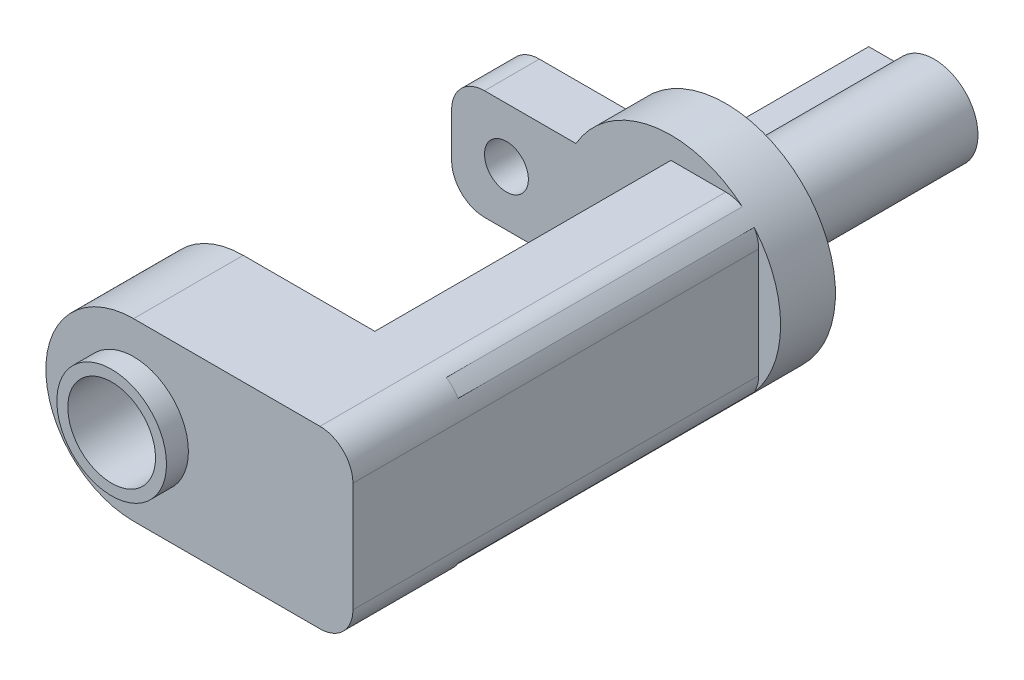
ISO-10303-21;
HEADER;
FILE_DESCRIPTION(('STEP AP214'),'2;1');
FILE_NAME('part.step','',(''),(''),'','','');
FILE_SCHEMA(('AUTOMOTIVE_DESIGN { 1 0 10303 214 1 1 1 1 }'));
ENDSEC;
DATA;
#1=APPLICATION_CONTEXT('core data for automotive mechanical design processes');
#2=APPLICATION_PROTOCOL_DEFINITION('international standard','automotive_design',2000,#1);
#3=PRODUCT_CONTEXT('',#1,'mechanical');
#4=PRODUCT('Part','Part','',(#3));
#5=PRODUCT_RELATED_PRODUCT_CATEGORY('part','',(#4));
#6=PRODUCT_DEFINITION_FORMATION('','',#4);
#7=PRODUCT_DEFINITION_CONTEXT('part definition',#1,'design');
#8=PRODUCT_DEFINITION('design','',#6,#7);
#9=PRODUCT_DEFINITION_SHAPE('','',#8);
#10=(LENGTH_UNIT() NAMED_UNIT(*) SI_UNIT(.MILLI.,.METRE.));
#11=(NAMED_UNIT(*) PLANE_ANGLE_UNIT() SI_UNIT($,.RADIAN.));
#12=(NAMED_UNIT(*) SI_UNIT($,.STERADIAN.) SOLID_ANGLE_UNIT());
#13=UNCERTAINTY_MEASURE_WITH_UNIT(LENGTH_MEASURE(1.E-05),#10,'distance_accuracy_value','');
#14=(GEOMETRIC_REPRESENTATION_CONTEXT(3) GLOBAL_UNCERTAINTY_ASSIGNED_CONTEXT((#13)) GLOBAL_UNIT_ASSIGNED_CONTEXT((#10,
#11,#12)) REPRESENTATION_CONTEXT('',''));
#15=CARTESIAN_POINT('',(0.,0.,0.));
#16=DIRECTION('',(0.,0.,1.));
#17=DIRECTION('',(1.,0.,0.));
#18=AXIS2_PLACEMENT_3D('',#15,#16,#17);
#19=CARTESIAN_POINT('',(0.,0.,61.));
#20=DIRECTION('',(0.,0.,1.));
#21=DIRECTION('',(1.,0.,0.));
#22=AXIS2_PLACEMENT_3D('',#19,#20,#21);
#23=PLANE('',#22);
#24=CARTESIAN_POINT('',(-12.,0.,61.));
#25=DIRECTION('',(0.,0.,1.));
#26=DIRECTION('',(1.,0.,0.));
#27=AXIS2_PLACEMENT_3D('',#24,#25,#26);
#28=CIRCLE('',#27,7.99999999999999);
#29=CARTESIAN_POINT('',(-12.,-7.99999999999999,61.));
#30=VERTEX_POINT('',#29);
#31=CARTESIAN_POINT('',(-12.,7.99999999999999,61.));
#32=VERTEX_POINT('',#31);
#33=EDGE_CURVE('E339',#30,#32,#28,.F.);
#34=ORIENTED_EDGE('',*,*,#33,.F.);
#35=DIRECTION('',(1.,0.,0.));
#36=VECTOR('',#35,1.);
#37=CARTESIAN_POINT('',(0.,-8.,61.));
#38=LINE('',#37,#36);
#39=CARTESIAN_POINT('',(4.99999999999998,-7.99999999999999,61.));
#40=VERTEX_POINT('',#39);
#41=EDGE_CURVE('E342',#30,#40,#38,.T.);
#42=ORIENTED_EDGE('',*,*,#41,.T.);
#43=CARTESIAN_POINT('',(5.,-5.,61.));
#44=DIRECTION('',(0.,0.,1.));
#45=DIRECTION('',(1.,0.,0.));
#46=AXIS2_PLACEMENT_3D('',#43,#44,#45);
#47=CIRCLE('',#46,3.);
#48=CARTESIAN_POINT('',(8.,-4.99999999999998,61.));
#49=VERTEX_POINT('',#48);
#50=EDGE_CURVE('E345',#49,#40,#47,.F.);
#51=ORIENTED_EDGE('',*,*,#50,.F.);
#52=DIRECTION('',(0.,1.,0.));
#53=VECTOR('',#52,1.);
#54=CARTESIAN_POINT('',(8.,0.,61.));
#55=LINE('',#54,#53);
#56=CARTESIAN_POINT('',(8.,4.99999999999998,61.));
#57=VERTEX_POINT('',#56);
#58=EDGE_CURVE('E348',#49,#57,#55,.T.);
#59=ORIENTED_EDGE('',*,*,#58,.T.);
#60=CARTESIAN_POINT('',(5.,5.,61.));
#61=DIRECTION('',(0.,0.,1.));
#62=DIRECTION('',(1.,0.,0.));
#63=AXIS2_PLACEMENT_3D('',#60,#61,#62);
#64=CIRCLE('',#63,3.);
#65=CARTESIAN_POINT('',(4.99999999999998,7.99999999999999,61.));
#66=VERTEX_POINT('',#65);
#67=EDGE_CURVE('E350',#57,#66,#64,.T.);
#68=ORIENTED_EDGE('',*,*,#67,.T.);
#69=DIRECTION('',(1.,0.,0.));
#70=VECTOR('',#69,1.);
#71=CARTESIAN_POINT('',(0.,8.00000000000003,61.));
#72=LINE('',#71,#70);
#73=EDGE_CURVE('E352',#32,#66,#72,.T.);
#74=ORIENTED_EDGE('',*,*,#73,.F.);
#75=EDGE_LOOP('',(#34,#42,#51,#59,#68,#74));
#76=FACE_BOUND('',#75,.T.);
#77=CARTESIAN_POINT('',(-12.,0.,61.));
#78=DIRECTION('',(0.,0.,1.));
#79=DIRECTION('',(1.,0.,0.));
#80=AXIS2_PLACEMENT_3D('',#77,#78,#79);
#81=CIRCLE('',#80,5.);
#82=CARTESIAN_POINT('',(-7.00000000000001,0.,61.));
#83=VERTEX_POINT('',#82);
#84=EDGE_CURVE('E588',#83,#83,#81,.T.);
#85=ORIENTED_EDGE('',*,*,#84,.F.);
#86=EDGE_LOOP('',(#85));
#87=FACE_BOUND('',#86,.T.);
#88=ADVANCED_FACE('F49',(#76,#87),#23,.T.);
#89=CARTESIAN_POINT('',(0.,0.,51.));
#90=DIRECTION('',(0.,0.,1.));
#91=DIRECTION('',(1.,0.,0.));
#92=AXIS2_PLACEMENT_3D('',#89,#90,#91);
#93=PLANE('',#92);
#94=CARTESIAN_POINT('',(-12.,0.,51.));
#95=DIRECTION('',(0.,0.,1.));
#96=DIRECTION('',(1.,0.,0.));
#97=AXIS2_PLACEMENT_3D('',#94,#95,#96);
#98=CIRCLE('',#97,4.);
#99=CARTESIAN_POINT('',(-8.00000000000001,0.,51.));
#100=VERTEX_POINT('',#99);
#101=EDGE_CURVE('E343',#100,#100,#98,.F.);
#102=ORIENTED_EDGE('',*,*,#101,.F.);
#103=EDGE_LOOP('',(#102));
#104=FACE_BOUND('',#103,.T.);
#105=CARTESIAN_POINT('',(0.,0.,51.));
#106=DIRECTION('',(0.,0.,1.));
#107=DIRECTION('',(1.,0.,0.));
#108=AXIS2_PLACEMENT_3D('',#105,#106,#107);
#109=CIRCLE('',#108,4.00000000000001);
#110=CARTESIAN_POINT('',(-2.79941684889507,2.85714285714286,51.));
#111=VERTEX_POINT('',#110);
#112=CARTESIAN_POINT('',(-2.79941684889506,-2.85714285714286,51.));
#113=VERTEX_POINT('',#112);
#114=EDGE_CURVE('E397',#111,#113,#109,.T.);
#115=ORIENTED_EDGE('',*,*,#114,.T.);
#116=CARTESIAN_POINT('',(-9.79795897113271,-10.,51.));
#117=DIRECTION('',(0.,0.,1.));
#118=DIRECTION('',(1.,0.,0.));
#119=AXIS2_PLACEMENT_3D('',#116,#117,#118);
#120=CIRCLE('',#119,10.);
#121=CARTESIAN_POINT('',(0.,-7.99999999999999,51.));
#122=VERTEX_POINT('',#121);
#123=EDGE_CURVE('E11',#113,#122,#120,.F.);
#124=ORIENTED_EDGE('',*,*,#123,.T.);
#125=DIRECTION('',(1.,0.,0.));
#126=VECTOR('',#125,1.);
#127=CARTESIAN_POINT('',(0.,-8.,51.));
#128=LINE('',#127,#126);
#129=CARTESIAN_POINT('',(-12.,-7.99999999999999,51.));
#130=VERTEX_POINT('',#129);
#131=EDGE_CURVE('E358',#130,#122,#128,.T.);
#132=ORIENTED_EDGE('',*,*,#131,.F.);
#133=CARTESIAN_POINT('',(-12.,0.,51.));
#134=DIRECTION('',(0.,0.,1.));
#135=DIRECTION('',(1.,0.,0.));
#136=AXIS2_PLACEMENT_3D('',#133,#134,#135);
#137=CIRCLE('',#136,7.99999999999999);
#138=CARTESIAN_POINT('',(-12.,7.99999999999999,51.));
#139=VERTEX_POINT('',#138);
#140=EDGE_CURVE('E325',#130,#139,#137,.F.);
#141=ORIENTED_EDGE('',*,*,#140,.T.);
#142=DIRECTION('',(1.,0.,0.));
#143=VECTOR('',#142,1.);
#144=CARTESIAN_POINT('',(0.,8.00000000000003,51.));
#145=LINE('',#144,#143);
#146=CARTESIAN_POINT('',(0.,7.99999999999999,51.));
#147=VERTEX_POINT('',#146);
#148=EDGE_CURVE('E367',#139,#147,#145,.T.);
#149=ORIENTED_EDGE('',*,*,#148,.T.);
#150=CARTESIAN_POINT('',(-9.79795897113272,10.,51.));
#151=DIRECTION('',(0.,0.,1.));
#152=DIRECTION('',(1.,0.,0.));
#153=AXIS2_PLACEMENT_3D('',#150,#151,#152);
#154=CIRCLE('',#153,10.);
#155=EDGE_CURVE('E57',#147,#111,#154,.F.);
#156=ORIENTED_EDGE('',*,*,#155,.T.);
#157=EDGE_LOOP('',(#115,#124,#132,#141,#149,#156));
#158=FACE_BOUND('',#157,.T.);
#159=ADVANCED_FACE('F453',(#104,#158),#93,.F.);
#160=CARTESIAN_POINT('',(5.,5.,51.));
#161=DIRECTION('',(0.,0.,1.));
#162=DIRECTION('',(1.,0.,0.));
#163=AXIS2_PLACEMENT_3D('',#160,#161,#162);
#164=CIRCLE('',#163,3.);
#165=CARTESIAN_POINT('',(7.59543560573178,6.50456439426822,51.));
#166=VERTEX_POINT('',#165);
#167=CARTESIAN_POINT('',(6.50456439426823,7.59543560573177,51.));
#168=VERTEX_POINT('',#167);
#169=EDGE_CURVE('E364',#166,#168,#164,.T.);
#170=ORIENTED_EDGE('',*,*,#169,.F.);
#171=CARTESIAN_POINT('',(0.,0.,51.));
#172=DIRECTION('',(0.,0.,1.));
#173=DIRECTION('',(1.,0.,0.));
#174=AXIS2_PLACEMENT_3D('',#171,#172,#173);
#175=CIRCLE('',#174,10.);
#176=EDGE_CURVE('E300',#166,#168,#175,.T.);
#177=ORIENTED_EDGE('',*,*,#176,.T.);
#178=EDGE_LOOP('',(#170,#177));
#179=FACE_BOUND('',#178,.T.);
#180=ADVANCED_FACE('F478',(#179),#93,.F.);
#181=CARTESIAN_POINT('',(-12.,0.,61.));
#182=DIRECTION('',(0.,0.,-1.));
#183=DIRECTION('',(-1.,0.,0.));
#184=AXIS2_PLACEMENT_3D('',#181,#182,#183);
#185=CYLINDRICAL_SURFACE('',#184,7.99999999999999);
#186=ORIENTED_EDGE('',*,*,#140,.F.);
#187=DIRECTION('',(0.,0.,-1.));
#188=VECTOR('',#187,1.);
#189=CARTESIAN_POINT('',(-12.,-7.99999999999999,61.));
#190=LINE('',#189,#188);
#191=EDGE_CURVE('E384',#30,#130,#190,.T.);
#192=ORIENTED_EDGE('',*,*,#191,.F.);
#193=ORIENTED_EDGE('',*,*,#33,.T.);
#194=DIRECTION('',(0.,0.,-1.));
#195=VECTOR('',#194,1.);
#196=CARTESIAN_POINT('',(-12.,7.99999999999999,61.));
#197=LINE('',#196,#195);
#198=EDGE_CURVE('E355',#32,#139,#197,.T.);
#199=ORIENTED_EDGE('',*,*,#198,.T.);
#200=EDGE_LOOP('',(#186,#192,#193,#199));
#201=FACE_BOUND('',#200,.T.);
#202=ADVANCED_FACE('F457',(#201),#185,.T.);
#203=CARTESIAN_POINT('',(0.,-8.,61.));
#204=DIRECTION('',(0.,1.,0.));
#205=DIRECTION('',(0.,0.,1.));
#206=AXIS2_PLACEMENT_3D('',#203,#204,#205);
#207=PLANE('',#206);
#208=ORIENTED_EDGE('',*,*,#131,.T.);
#209=DIRECTION('',(0.,0.,-1.));
#210=VECTOR('',#209,1.);
#211=CARTESIAN_POINT('',(0.,-7.99999999999999,68.8885438199983));
#212=LINE('',#211,#210);
#213=CARTESIAN_POINT('',(0.,-7.99999999999999,24.));
#214=VERTEX_POINT('',#213);
#215=EDGE_CURVE('E315',#122,#214,#212,.T.);
#216=ORIENTED_EDGE('',*,*,#215,.T.);
#217=DIRECTION('',(1.,0.,0.));
#218=VECTOR('',#217,1.);
#219=CARTESIAN_POINT('',(0.,-7.99999999999999,24.));
#220=LINE('',#219,#218);
#221=CARTESIAN_POINT('',(4.99999999999998,-8.,24.));
#222=VERTEX_POINT('',#221);
#223=EDGE_CURVE('E312',#214,#222,#220,.T.);
#224=ORIENTED_EDGE('',*,*,#223,.T.);
#225=DIRECTION('',(0.,0.,-1.));
#226=VECTOR('',#225,1.);
#227=CARTESIAN_POINT('',(4.99999999999998,-7.99999999999999,61.));
#228=LINE('',#227,#226);
#229=EDGE_CURVE('E381',#40,#222,#228,.T.);
#230=ORIENTED_EDGE('',*,*,#229,.F.);
#231=ORIENTED_EDGE('',*,*,#41,.F.);
#232=ORIENTED_EDGE('',*,*,#191,.T.);
#233=EDGE_LOOP('',(#208,#216,#224,#230,#231,#232));
#234=FACE_BOUND('',#233,.T.);
#235=ADVANCED_FACE('F447',(#234),#207,.F.);
#236=CARTESIAN_POINT('',(5.,-5.,61.));
#237=DIRECTION('',(0.,0.,-1.));
#238=DIRECTION('',(-1.,0.,0.));
#239=AXIS2_PLACEMENT_3D('',#236,#237,#238);
#240=CYLINDRICAL_SURFACE('',#239,3.);
#241=CARTESIAN_POINT('',(5.,-5.,51.));
#242=DIRECTION('',(0.,0.,1.));
#243=DIRECTION('',(1.,0.,0.));
#244=AXIS2_PLACEMENT_3D('',#241,#242,#243);
#245=CIRCLE('',#244,3.);
#246=CARTESIAN_POINT('',(7.59543560573178,-6.50456439426822,51.));
#247=VERTEX_POINT('',#246);
#248=CARTESIAN_POINT('',(6.50456439426823,-7.59543560573177,51.));
#249=VERTEX_POINT('',#248);
#250=EDGE_CURVE('E361',#247,#249,#245,.F.);
#251=ORIENTED_EDGE('',*,*,#250,.F.);
#252=DIRECTION('',(0.,0.,-1.));
#253=VECTOR('',#252,1.);
#254=CARTESIAN_POINT('',(7.59543560573178,-6.50456439426822,68.8885438199983));
#255=LINE('',#254,#253);
#256=CARTESIAN_POINT('',(7.59543560573178,-6.50456439426822,24.));
#257=VERTEX_POINT('',#256);
#258=EDGE_CURVE('E307',#247,#257,#255,.T.);
#259=ORIENTED_EDGE('',*,*,#258,.T.);
#260=CARTESIAN_POINT('',(5.,-5.,24.));
#261=DIRECTION('',(0.,0.,1.));
#262=DIRECTION('',(1.,0.,0.));
#263=AXIS2_PLACEMENT_3D('',#260,#261,#262);
#264=CIRCLE('',#263,3.);
#265=CARTESIAN_POINT('',(8.,-4.99999999999998,24.));
#266=VERTEX_POINT('',#265);
#267=EDGE_CURVE('E304',#257,#266,#264,.T.);
#268=ORIENTED_EDGE('',*,*,#267,.T.);
#269=DIRECTION('',(0.,0.,-1.));
#270=VECTOR('',#269,1.);
#271=CARTESIAN_POINT('',(8.,-4.99999999999998,61.));
#272=LINE('',#271,#270);
#273=EDGE_CURVE('E378',#49,#266,#272,.T.);
#274=ORIENTED_EDGE('',*,*,#273,.F.);
#275=ORIENTED_EDGE('',*,*,#50,.T.);
#276=ORIENTED_EDGE('',*,*,#229,.T.);
#277=CARTESIAN_POINT('',(5.,-5.,24.));
#278=DIRECTION('',(0.,0.,1.));
#279=DIRECTION('',(1.,0.,0.));
#280=AXIS2_PLACEMENT_3D('',#277,#278,#279);
#281=CIRCLE('',#280,3.);
#282=CARTESIAN_POINT('',(6.50456439426823,-7.59543560573177,24.));
#283=VERTEX_POINT('',#282);
#284=EDGE_CURVE('E308',#222,#283,#281,.T.);
#285=ORIENTED_EDGE('',*,*,#284,.T.);
#286=DIRECTION('',(0.,0.,-1.));
#287=VECTOR('',#286,1.);
#288=CARTESIAN_POINT('',(6.50456439426823,-7.59543560573177,68.8885438199983));
#289=LINE('',#288,#287);
#290=EDGE_CURVE('E311',#249,#283,#289,.T.);
#291=ORIENTED_EDGE('',*,*,#290,.F.);
#292=EDGE_LOOP('',(#251,#259,#268,#274,#275,#276,#285,#291));
#293=FACE_BOUND('',#292,.T.);
#294=ADVANCED_FACE('F442',(#293),#240,.T.);
#295=CARTESIAN_POINT('',(8.,0.,61.));
#296=DIRECTION('',(-1.,0.,0.));
#297=DIRECTION('',(0.,0.,1.));
#298=AXIS2_PLACEMENT_3D('',#295,#296,#297);
#299=PLANE('',#298);
#300=ORIENTED_EDGE('',*,*,#273,.T.);
#301=DIRECTION('',(0.,1.,0.));
#302=VECTOR('',#301,1.);
#303=CARTESIAN_POINT('',(8.,0.,24.));
#304=LINE('',#303,#302);
#305=CARTESIAN_POINT('',(8.,5.,24.));
#306=VERTEX_POINT('',#305);
#307=EDGE_CURVE('E301',#266,#306,#304,.T.);
#308=ORIENTED_EDGE('',*,*,#307,.T.);
#309=DIRECTION('',(0.,0.,-1.));
#310=VECTOR('',#309,1.);
#311=CARTESIAN_POINT('',(8.,4.99999999999998,61.));
#312=LINE('',#311,#310);
#313=EDGE_CURVE('E375',#57,#306,#312,.T.);
#314=ORIENTED_EDGE('',*,*,#313,.F.);
#315=ORIENTED_EDGE('',*,*,#58,.F.);
#316=EDGE_LOOP('',(#300,#308,#314,#315));
#317=FACE_BOUND('',#316,.T.);
#318=ADVANCED_FACE('F496',(#317),#299,.F.);
#319=CARTESIAN_POINT('',(5.,5.,61.));
#320=DIRECTION('',(0.,0.,-1.));
#321=DIRECTION('',(-1.,0.,0.));
#322=AXIS2_PLACEMENT_3D('',#319,#320,#321);
#323=CYLINDRICAL_SURFACE('',#322,3.);
#324=ORIENTED_EDGE('',*,*,#313,.T.);
#325=CARTESIAN_POINT('',(5.,5.,24.));
#326=DIRECTION('',(0.,0.,1.));
#327=DIRECTION('',(1.,0.,0.));
#328=AXIS2_PLACEMENT_3D('',#325,#326,#327);
#329=CIRCLE('',#328,3.);
#330=CARTESIAN_POINT('',(7.59543560573178,6.50456439426822,24.));
#331=VERTEX_POINT('',#330);
#332=EDGE_CURVE('E297',#306,#331,#329,.T.);
#333=ORIENTED_EDGE('',*,*,#332,.T.);
#334=DIRECTION('',(0.,0.,-1.));
#335=VECTOR('',#334,1.);
#336=CARTESIAN_POINT('',(7.59543560573178,6.50456439426822,68.8885438199983));
#337=LINE('',#336,#335);
#338=EDGE_CURVE('E296',#166,#331,#337,.T.);
#339=ORIENTED_EDGE('',*,*,#338,.F.);
#340=ORIENTED_EDGE('',*,*,#169,.T.);
#341=DIRECTION('',(0.,0.,-1.));
#342=VECTOR('',#341,1.);
#343=CARTESIAN_POINT('',(6.50456439426823,7.59543560573177,68.8885438199983));
#344=LINE('',#343,#342);
#345=CARTESIAN_POINT('',(6.50456439426823,7.59543560573177,24.));
#346=VERTEX_POINT('',#345);
#347=EDGE_CURVE('E321',#168,#346,#344,.T.);
#348=ORIENTED_EDGE('',*,*,#347,.T.);
#349=CARTESIAN_POINT('',(5.,5.,24.));
#350=DIRECTION('',(0.,0.,1.));
#351=DIRECTION('',(1.,0.,0.));
#352=AXIS2_PLACEMENT_3D('',#349,#350,#351);
#353=CIRCLE('',#352,3.);
#354=CARTESIAN_POINT('',(4.99999999999998,7.99999999999999,24.));
#355=VERTEX_POINT('',#354);
#356=EDGE_CURVE('E217',#346,#355,#353,.T.);
#357=ORIENTED_EDGE('',*,*,#356,.T.);
#358=DIRECTION('',(0.,0.,-1.));
#359=VECTOR('',#358,1.);
#360=CARTESIAN_POINT('',(4.99999999999998,7.99999999999999,61.));
#361=LINE('',#360,#359);
#362=EDGE_CURVE('E372',#66,#355,#361,.T.);
#363=ORIENTED_EDGE('',*,*,#362,.F.);
#364=ORIENTED_EDGE('',*,*,#67,.F.);
#365=EDGE_LOOP('',(#324,#333,#339,#340,#348,#357,#363,#364));
#366=FACE_BOUND('',#365,.T.);
#367=ADVANCED_FACE('F493',(#366),#323,.T.);
#368=CARTESIAN_POINT('',(0.,8.00000000000003,61.));
#369=DIRECTION('',(0.,1.,0.));
#370=DIRECTION('',(-1.,0.,0.));
#371=AXIS2_PLACEMENT_3D('',#368,#369,#370);
#372=PLANE('',#371);
#373=ORIENTED_EDGE('',*,*,#148,.F.);
#374=ORIENTED_EDGE('',*,*,#198,.F.);
#375=ORIENTED_EDGE('',*,*,#73,.T.);
#376=ORIENTED_EDGE('',*,*,#362,.T.);
#377=DIRECTION('',(-1.,0.,0.));
#378=VECTOR('',#377,1.);
#379=CARTESIAN_POINT('',(0.,7.99999999999999,24.));
#380=LINE('',#379,#378);
#381=CARTESIAN_POINT('',(0.,7.99999999999999,24.));
#382=VERTEX_POINT('',#381);
#383=EDGE_CURVE('E316',#355,#382,#380,.T.);
#384=ORIENTED_EDGE('',*,*,#383,.T.);
#385=DIRECTION('',(0.,0.,-1.));
#386=VECTOR('',#385,1.);
#387=CARTESIAN_POINT('',(0.,7.99999999999999,68.8885438199983));
#388=LINE('',#387,#386);
#389=EDGE_CURVE('E319',#147,#382,#388,.T.);
#390=ORIENTED_EDGE('',*,*,#389,.F.);
#391=EDGE_LOOP('',(#373,#374,#375,#376,#384,#390));
#392=FACE_BOUND('',#391,.T.);
#393=ADVANCED_FACE('F461',(#392),#372,.T.);
#394=CARTESIAN_POINT('',(-12.,0.,61.));
#395=DIRECTION('',(0.,0.,-1.));
#396=DIRECTION('',(-1.,0.,0.));
#397=AXIS2_PLACEMENT_3D('',#394,#395,#396);
#398=CYLINDRICAL_SURFACE('',#397,4.);
#399=ORIENTED_EDGE('',*,*,#101,.T.);
#400=EDGE_LOOP('',(#399));
#401=FACE_BOUND('',#400,.T.);
#402=CARTESIAN_POINT('',(-12.,0.,63.));
#403=DIRECTION('',(0.,0.,1.));
#404=DIRECTION('',(1.,0.,0.));
#405=AXIS2_PLACEMENT_3D('',#402,#403,#404);
#406=CIRCLE('',#405,4.);
#407=CARTESIAN_POINT('',(-8.00000000000001,0.,63.));
#408=VERTEX_POINT('',#407);
#409=EDGE_CURVE('E589',#408,#408,#406,.T.);
#410=ORIENTED_EDGE('',*,*,#409,.T.);
#411=EDGE_LOOP('',(#410));
#412=FACE_BOUND('',#411,.T.);
#413=ADVANCED_FACE('F487',(#401,#412),#398,.F.);
#414=ORIENTED_EDGE('',*,*,#250,.T.);
#415=CARTESIAN_POINT('',(0.,0.,51.));
#416=DIRECTION('',(0.,0.,1.));
#417=DIRECTION('',(1.,0.,0.));
#418=AXIS2_PLACEMENT_3D('',#415,#416,#417);
#419=CIRCLE('',#418,10.);
#420=EDGE_CURVE('E322',#249,#247,#419,.T.);
#421=ORIENTED_EDGE('',*,*,#420,.T.);
#422=EDGE_LOOP('',(#414,#421));
#423=FACE_BOUND('',#422,.T.);
#424=ADVANCED_FACE('F481',(#423),#93,.F.);
#425=CARTESIAN_POINT('',(0.,0.,68.8885438199983));
#426=DIRECTION('',(0.,0.,-1.));
#427=DIRECTION('',(-1.,0.,0.));
#428=AXIS2_PLACEMENT_3D('',#425,#426,#427);
#429=CYLINDRICAL_SURFACE('',#428,10.);
#430=ORIENTED_EDGE('',*,*,#176,.F.);
#431=ORIENTED_EDGE('',*,*,#338,.T.);
#432=CARTESIAN_POINT('',(0.,0.,24.));
#433=DIRECTION('',(0.,0.,1.));
#434=DIRECTION('',(1.,0.,0.));
#435=AXIS2_PLACEMENT_3D('',#432,#433,#434);
#436=CIRCLE('',#435,10.);
#437=EDGE_CURVE('E221',#257,#331,#436,.T.);
#438=ORIENTED_EDGE('',*,*,#437,.F.);
#439=ORIENTED_EDGE('',*,*,#258,.F.);
#440=ORIENTED_EDGE('',*,*,#420,.F.);
#441=ORIENTED_EDGE('',*,*,#290,.T.);
#442=CARTESIAN_POINT('',(-8.66025403784439,-5.,24.));
#443=VERTEX_POINT('',#442);
#444=EDGE_CURVE('E224',#443,#283,#436,.T.);
#445=ORIENTED_EDGE('',*,*,#444,.F.);
#446=DIRECTION('',(0.,0.,-1.));
#447=VECTOR('',#446,1.);
#448=CARTESIAN_POINT('',(-8.66025403784439,-5.,24.));
#449=LINE('',#448,#447);
#450=CARTESIAN_POINT('',(-8.66025403784439,-5.,19.));
#451=VERTEX_POINT('',#450);
#452=EDGE_CURVE('E241',#443,#451,#449,.T.);
#453=ORIENTED_EDGE('',*,*,#452,.T.);
#454=CARTESIAN_POINT('',(0.,0.,19.));
#455=DIRECTION('',(0.,0.,1.));
#456=DIRECTION('',(1.,0.,0.));
#457=AXIS2_PLACEMENT_3D('',#454,#455,#456);
#458=CIRCLE('',#457,10.);
#459=CARTESIAN_POINT('',(-8.66025403784439,4.99999999999999,19.));
#460=VERTEX_POINT('',#459);
#461=EDGE_CURVE('E239',#451,#460,#458,.T.);
#462=ORIENTED_EDGE('',*,*,#461,.T.);
#463=DIRECTION('',(0.,0.,-1.));
#464=VECTOR('',#463,1.);
#465=CARTESIAN_POINT('',(-8.66025403784439,4.99999999999999,24.));
#466=LINE('',#465,#464);
#467=CARTESIAN_POINT('',(-8.66025403784439,4.99999999999999,24.));
#468=VERTEX_POINT('',#467);
#469=EDGE_CURVE('E229',#468,#460,#466,.T.);
#470=ORIENTED_EDGE('',*,*,#469,.F.);
#471=EDGE_CURVE('E210',#346,#468,#436,.T.);
#472=ORIENTED_EDGE('',*,*,#471,.F.);
#473=ORIENTED_EDGE('',*,*,#347,.F.);
#474=EDGE_LOOP('',(#430,#431,#438,#439,#440,#441,#445,#453,#462,#470,#472,#473));
#475=FACE_BOUND('',#474,.T.);
#476=ADVANCED_FACE('F236',(#475),#429,.T.);
#477=CARTESIAN_POINT('',(0.,0.,24.));
#478=DIRECTION('',(0.,0.,1.));
#479=DIRECTION('',(1.,0.,0.));
#480=AXIS2_PLACEMENT_3D('',#477,#478,#479);
#481=PLANE('',#480);
#482=CARTESIAN_POINT('',(-15.,0.,24.));
#483=DIRECTION('',(0.,0.,1.));
#484=DIRECTION('',(1.,0.,0.));
#485=AXIS2_PLACEMENT_3D('',#482,#483,#484);
#486=CIRCLE('',#485,2.);
#487=CARTESIAN_POINT('',(-13.,0.,24.));
#488=VERTEX_POINT('',#487);
#489=EDGE_CURVE('E402',#488,#488,#486,.T.);
#490=ORIENTED_EDGE('',*,*,#489,.F.);
#491=EDGE_LOOP('',(#490));
#492=FACE_BOUND('',#491,.T.);
#493=ORIENTED_EDGE('',*,*,#223,.F.);
#494=CARTESIAN_POINT('',(-9.79795897113271,-10.,24.));
#495=DIRECTION('',(0.,0.,1.));
#496=DIRECTION('',(1.,0.,0.));
#497=AXIS2_PLACEMENT_3D('',#494,#495,#496);
#498=CIRCLE('',#497,10.);
#499=CARTESIAN_POINT('',(-2.79941684889506,-2.85714285714286,24.));
#500=VERTEX_POINT('',#499);
#501=EDGE_CURVE('E388',#214,#500,#498,.T.);
#502=ORIENTED_EDGE('',*,*,#501,.T.);
#503=CARTESIAN_POINT('',(0.,0.,24.));
#504=DIRECTION('',(0.,0.,1.));
#505=DIRECTION('',(1.,0.,0.));
#506=AXIS2_PLACEMENT_3D('',#503,#504,#505);
#507=CIRCLE('',#506,4.00000000000001);
#508=CARTESIAN_POINT('',(-2.79941684889507,2.85714285714286,24.));
#509=VERTEX_POINT('',#508);
#510=EDGE_CURVE('E396',#509,#500,#507,.T.);
#511=ORIENTED_EDGE('',*,*,#510,.F.);
#512=CARTESIAN_POINT('',(-9.79795897113272,10.,24.));
#513=DIRECTION('',(0.,0.,1.));
#514=DIRECTION('',(1.,0.,0.));
#515=AXIS2_PLACEMENT_3D('',#512,#513,#514);
#516=CIRCLE('',#515,10.);
#517=EDGE_CURVE('E386',#509,#382,#516,.T.);
#518=ORIENTED_EDGE('',*,*,#517,.T.);
#519=ORIENTED_EDGE('',*,*,#383,.F.);
#520=ORIENTED_EDGE('',*,*,#356,.F.);
#521=ORIENTED_EDGE('',*,*,#471,.T.);
#522=DIRECTION('',(-1.,0.,0.));
#523=VECTOR('',#522,1.);
#524=CARTESIAN_POINT('',(-8.66025403784439,4.99999999999999,24.));
#525=LINE('',#524,#523);
#526=CARTESIAN_POINT('',(-17.,5.,24.));
#527=VERTEX_POINT('',#526);
#528=EDGE_CURVE('E214',#468,#527,#525,.T.);
#529=ORIENTED_EDGE('',*,*,#528,.T.);
#530=CARTESIAN_POINT('',(-17.,2.,24.));
#531=DIRECTION('',(0.,0.,1.));
#532=DIRECTION('',(1.,0.,0.));
#533=AXIS2_PLACEMENT_3D('',#530,#531,#532);
#534=CIRCLE('',#533,3.);
#535=CARTESIAN_POINT('',(-20.,2.,24.));
#536=VERTEX_POINT('',#535);
#537=EDGE_CURVE('E291',#527,#536,#534,.T.);
#538=ORIENTED_EDGE('',*,*,#537,.T.);
#539=DIRECTION('',(0.,-1.,0.));
#540=VECTOR('',#539,1.);
#541=CARTESIAN_POINT('',(-20.,5.,24.));
#542=LINE('',#541,#540);
#543=CARTESIAN_POINT('',(-20.,-2.,24.));
#544=VERTEX_POINT('',#543);
#545=EDGE_CURVE('E233',#536,#544,#542,.T.);
#546=ORIENTED_EDGE('',*,*,#545,.T.);
#547=CARTESIAN_POINT('',(-17.,-2.,24.));
#548=DIRECTION('',(0.,0.,1.));
#549=DIRECTION('',(1.,0.,0.));
#550=AXIS2_PLACEMENT_3D('',#547,#548,#549);
#551=CIRCLE('',#550,3.);
#552=CARTESIAN_POINT('',(-17.,-5.,24.));
#553=VERTEX_POINT('',#552);
#554=EDGE_CURVE('E293',#544,#553,#551,.T.);
#555=ORIENTED_EDGE('',*,*,#554,.T.);
#556=DIRECTION('',(1.,0.,0.));
#557=VECTOR('',#556,1.);
#558=CARTESIAN_POINT('',(-20.,-5.,24.));
#559=LINE('',#558,#557);
#560=EDGE_CURVE('E246',#553,#443,#559,.T.);
#561=ORIENTED_EDGE('',*,*,#560,.T.);
#562=ORIENTED_EDGE('',*,*,#444,.T.);
#563=ORIENTED_EDGE('',*,*,#284,.F.);
#564=EDGE_LOOP('',(#493,#502,#511,#518,#519,#520,#521,#529,#538,#546,#555,#561,#562,#563));
#565=FACE_BOUND('',#564,.T.);
#566=ADVANCED_FACE('F213',(#492,#565),#481,.T.);
#567=CARTESIAN_POINT('',(0.,-2.,19.));
#568=DIRECTION('',(0.,1.,0.));
#569=DIRECTION('',(0.,0.,1.));
#570=AXIS2_PLACEMENT_3D('',#567,#568,#569);
#571=PLANE('',#570);
#572=DIRECTION('',(1.,0.,0.));
#573=VECTOR('',#572,1.);
#574=CARTESIAN_POINT('',(0.,-2.,0.));
#575=LINE('',#574,#573);
#576=CARTESIAN_POINT('',(-5.96410161513776,-2.,0.));
#577=VERTEX_POINT('',#576);
#578=CARTESIAN_POINT('',(-3.46410161513776,-2.,0.));
#579=VERTEX_POINT('',#578);
#580=EDGE_CURVE('E240',#577,#579,#575,.T.);
#581=ORIENTED_EDGE('',*,*,#580,.T.);
#582=DIRECTION('',(0.,0.,-1.));
#583=VECTOR('',#582,1.);
#584=CARTESIAN_POINT('',(-3.46410161513776,-2.,19.));
#585=LINE('',#584,#583);
#586=CARTESIAN_POINT('',(-3.46410161513776,-2.,19.));
#587=VERTEX_POINT('',#586);
#588=EDGE_CURVE('E276',#587,#579,#585,.T.);
#589=ORIENTED_EDGE('',*,*,#588,.F.);
#590=DIRECTION('',(1.,0.,0.));
#591=VECTOR('',#590,1.);
#592=CARTESIAN_POINT('',(0.,-2.,19.));
#593=LINE('',#592,#591);
#594=CARTESIAN_POINT('',(-5.96410161513776,-2.,19.));
#595=VERTEX_POINT('',#594);
#596=EDGE_CURVE('E250',#595,#587,#593,.T.);
#597=ORIENTED_EDGE('',*,*,#596,.F.);
#598=DIRECTION('',(0.,0.,-1.));
#599=VECTOR('',#598,1.);
#600=CARTESIAN_POINT('',(-5.96410161513776,-2.,19.));
#601=LINE('',#600,#599);
#602=EDGE_CURVE('E262',#595,#577,#601,.T.);
#603=ORIENTED_EDGE('',*,*,#602,.T.);
#604=EDGE_LOOP('',(#581,#589,#597,#603));
#605=FACE_BOUND('',#604,.T.);
#606=ADVANCED_FACE('F531',(#605),#571,.F.);
#607=CARTESIAN_POINT('',(0.,0.,19.));
#608=DIRECTION('',(0.,0.,-1.));
#609=DIRECTION('',(-1.,0.,0.));
#610=AXIS2_PLACEMENT_3D('',#607,#608,#609);
#611=CYLINDRICAL_SURFACE('',#610,4.00000000000001);
#612=CARTESIAN_POINT('',(0.,0.,0.));
#613=DIRECTION('',(0.,0.,1.));
#614=DIRECTION('',(1.,0.,0.));
#615=AXIS2_PLACEMENT_3D('',#612,#613,#614);
#616=CIRCLE('',#615,4.00000000000001);
#617=CARTESIAN_POINT('',(-3.46410161513776,2.,0.));
#618=VERTEX_POINT('',#617);
#619=EDGE_CURVE('E244',#579,#618,#616,.T.);
#620=ORIENTED_EDGE('',*,*,#619,.T.);
#621=DIRECTION('',(0.,0.,-1.));
#622=VECTOR('',#621,1.);
#623=CARTESIAN_POINT('',(-3.46410161513776,2.,19.));
#624=LINE('',#623,#622);
#625=CARTESIAN_POINT('',(-3.46410161513776,2.,19.));
#626=VERTEX_POINT('',#625);
#627=EDGE_CURVE('E273',#626,#618,#624,.T.);
#628=ORIENTED_EDGE('',*,*,#627,.F.);
#629=CARTESIAN_POINT('',(0.,0.,19.));
#630=DIRECTION('',(0.,0.,1.));
#631=DIRECTION('',(1.,0.,0.));
#632=AXIS2_PLACEMENT_3D('',#629,#630,#631);
#633=CIRCLE('',#632,4.00000000000001);
#634=EDGE_CURVE('E253',#587,#626,#633,.T.);
#635=ORIENTED_EDGE('',*,*,#634,.F.);
#636=ORIENTED_EDGE('',*,*,#588,.T.);
#637=EDGE_LOOP('',(#620,#628,#635,#636));
#638=FACE_BOUND('',#637,.T.);
#639=ADVANCED_FACE('F537',(#638),#611,.T.);
#640=CARTESIAN_POINT('',(0.,2.,19.));
#641=DIRECTION('',(0.,-1.,0.));
#642=DIRECTION('',(0.,0.,-1.));
#643=AXIS2_PLACEMENT_3D('',#640,#641,#642);
#644=PLANE('',#643);
#645=DIRECTION('',(-1.,0.,0.));
#646=VECTOR('',#645,1.);
#647=CARTESIAN_POINT('',(0.,2.,0.));
#648=LINE('',#647,#646);
#649=CARTESIAN_POINT('',(-5.96410161513776,2.,0.));
#650=VERTEX_POINT('',#649);
#651=EDGE_CURVE('E265',#618,#650,#648,.T.);
#652=ORIENTED_EDGE('',*,*,#651,.T.);
#653=DIRECTION('',(0.,0.,-1.));
#654=VECTOR('',#653,1.);
#655=CARTESIAN_POINT('',(-5.96410161513776,2.,19.));
#656=LINE('',#655,#654);
#657=CARTESIAN_POINT('',(-5.96410161513776,2.,19.));
#658=VERTEX_POINT('',#657);
#659=EDGE_CURVE('E270',#658,#650,#656,.T.);
#660=ORIENTED_EDGE('',*,*,#659,.F.);
#661=DIRECTION('',(-1.,0.,0.));
#662=VECTOR('',#661,1.);
#663=CARTESIAN_POINT('',(0.,2.,19.));
#664=LINE('',#663,#662);
#665=EDGE_CURVE('E257',#626,#658,#664,.T.);
#666=ORIENTED_EDGE('',*,*,#665,.F.);
#667=ORIENTED_EDGE('',*,*,#627,.T.);
#668=EDGE_LOOP('',(#652,#660,#666,#667));
#669=FACE_BOUND('',#668,.T.);
#670=ADVANCED_FACE('F560',(#669),#644,.F.);
#671=CARTESIAN_POINT('',(-5.96410161513776,0.,19.));
#672=DIRECTION('',(1.,0.,0.));
#673=DIRECTION('',(0.,0.,-1.));
#674=AXIS2_PLACEMENT_3D('',#671,#672,#673);
#675=PLANE('',#674);
#676=DIRECTION('',(0.,-1.,0.));
#677=VECTOR('',#676,1.);
#678=CARTESIAN_POINT('',(-5.96410161513776,0.,0.));
#679=LINE('',#678,#677);
#680=EDGE_CURVE('E254',#650,#577,#679,.T.);
#681=ORIENTED_EDGE('',*,*,#680,.T.);
#682=ORIENTED_EDGE('',*,*,#602,.F.);
#683=DIRECTION('',(0.,-1.,0.));
#684=VECTOR('',#683,1.);
#685=CARTESIAN_POINT('',(-5.96410161513776,0.,19.));
#686=LINE('',#685,#684);
#687=EDGE_CURVE('E260',#658,#595,#686,.T.);
#688=ORIENTED_EDGE('',*,*,#687,.F.);
#689=ORIENTED_EDGE('',*,*,#659,.T.);
#690=EDGE_LOOP('',(#681,#682,#688,#689));
#691=FACE_BOUND('',#690,.T.);
#692=ADVANCED_FACE('F552',(#691),#675,.F.);
#693=CARTESIAN_POINT('',(0.,0.,0.));
#694=DIRECTION('',(0.,0.,1.));
#695=DIRECTION('',(1.,0.,0.));
#696=AXIS2_PLACEMENT_3D('',#693,#694,#695);
#697=PLANE('',#696);
#698=ORIENTED_EDGE('',*,*,#580,.F.);
#699=ORIENTED_EDGE('',*,*,#680,.F.);
#700=ORIENTED_EDGE('',*,*,#651,.F.);
#701=ORIENTED_EDGE('',*,*,#619,.F.);
#702=EDGE_LOOP('',(#698,#699,#700,#701));
#703=FACE_BOUND('',#702,.T.);
#704=ADVANCED_FACE('F527',(#703),#697,.F.);
#705=CARTESIAN_POINT('',(0.,0.,19.));
#706=DIRECTION('',(0.,0.,1.));
#707=DIRECTION('',(1.,0.,0.));
#708=AXIS2_PLACEMENT_3D('',#705,#706,#707);
#709=PLANE('',#708);
#710=DIRECTION('',(1.,0.,0.));
#711=VECTOR('',#710,1.);
#712=CARTESIAN_POINT('',(-20.,-5.,19.));
#713=LINE('',#712,#711);
#714=CARTESIAN_POINT('',(-17.,-5.,19.));
#715=VERTEX_POINT('',#714);
#716=EDGE_CURVE('E222',#715,#451,#713,.T.);
#717=ORIENTED_EDGE('',*,*,#716,.F.);
#718=CARTESIAN_POINT('',(-17.,-2.,19.));
#719=DIRECTION('',(0.,0.,1.));
#720=DIRECTION('',(1.,0.,0.));
#721=AXIS2_PLACEMENT_3D('',#718,#719,#720);
#722=CIRCLE('',#721,3.);
#723=CARTESIAN_POINT('',(-20.,-2.,19.));
#724=VERTEX_POINT('',#723);
#725=EDGE_CURVE('E284',#715,#724,#722,.F.);
#726=ORIENTED_EDGE('',*,*,#725,.T.);
#727=DIRECTION('',(0.,-1.,0.));
#728=VECTOR('',#727,1.);
#729=CARTESIAN_POINT('',(-20.,5.,19.));
#730=LINE('',#729,#728);
#731=CARTESIAN_POINT('',(-20.,2.,19.));
#732=VERTEX_POINT('',#731);
#733=EDGE_CURVE('E416',#732,#724,#730,.T.);
#734=ORIENTED_EDGE('',*,*,#733,.F.);
#735=CARTESIAN_POINT('',(-17.,2.,19.));
#736=DIRECTION('',(0.,0.,1.));
#737=DIRECTION('',(1.,0.,0.));
#738=AXIS2_PLACEMENT_3D('',#735,#736,#737);
#739=CIRCLE('',#738,3.);
#740=CARTESIAN_POINT('',(-17.,5.,19.));
#741=VERTEX_POINT('',#740);
#742=EDGE_CURVE('E282',#732,#741,#739,.F.);
#743=ORIENTED_EDGE('',*,*,#742,.T.);
#744=DIRECTION('',(-1.,0.,0.));
#745=VECTOR('',#744,1.);
#746=CARTESIAN_POINT('',(-8.66025403784439,4.99999999999999,19.));
#747=LINE('',#746,#745);
#748=EDGE_CURVE('E414',#460,#741,#747,.T.);
#749=ORIENTED_EDGE('',*,*,#748,.F.);
#750=ORIENTED_EDGE('',*,*,#461,.F.);
#751=EDGE_LOOP('',(#717,#726,#734,#743,#749,#750));
#752=FACE_BOUND('',#751,.T.);
#753=CARTESIAN_POINT('',(-15.,0.,19.));
#754=DIRECTION('',(0.,0.,1.));
#755=DIRECTION('',(1.,0.,0.));
#756=AXIS2_PLACEMENT_3D('',#753,#754,#755);
#757=CIRCLE('',#756,2.);
#758=CARTESIAN_POINT('',(-13.,0.,19.));
#759=VERTEX_POINT('',#758);
#760=EDGE_CURVE('E399',#759,#759,#757,.T.);
#761=ORIENTED_EDGE('',*,*,#760,.T.);
#762=EDGE_LOOP('',(#761));
#763=FACE_BOUND('',#762,.T.);
#764=ORIENTED_EDGE('',*,*,#687,.T.);
#765=ORIENTED_EDGE('',*,*,#596,.T.);
#766=ORIENTED_EDGE('',*,*,#634,.T.);
#767=ORIENTED_EDGE('',*,*,#665,.T.);
#768=EDGE_LOOP('',(#764,#765,#766,#767));
#769=FACE_BOUND('',#768,.T.);
#770=ADVANCED_FACE('F426',(#752,#763,#769),#709,.F.);
#771=ORIENTED_EDGE('',*,*,#307,.F.);
#772=ORIENTED_EDGE('',*,*,#267,.F.);
#773=ORIENTED_EDGE('',*,*,#437,.T.);
#774=ORIENTED_EDGE('',*,*,#332,.F.);
#775=EDGE_LOOP('',(#771,#772,#773,#774));
#776=FACE_BOUND('',#775,.T.);
#777=ADVANCED_FACE('F516',(#776),#481,.T.);
#778=CARTESIAN_POINT('',(-8.66025403784439,4.99999999999999,24.));
#779=DIRECTION('',(0.,-1.,0.));
#780=DIRECTION('',(1.,0.,0.));
#781=AXIS2_PLACEMENT_3D('',#778,#779,#780);
#782=PLANE('',#781);
#783=ORIENTED_EDGE('',*,*,#748,.T.);
#784=DIRECTION('',(0.,0.,-1.));
#785=VECTOR('',#784,1.);
#786=CARTESIAN_POINT('',(-17.,5.,24.));
#787=LINE('',#786,#785);
#788=EDGE_CURVE('E232',#741,#527,#787,.F.);
#789=ORIENTED_EDGE('',*,*,#788,.T.);
#790=ORIENTED_EDGE('',*,*,#528,.F.);
#791=ORIENTED_EDGE('',*,*,#469,.T.);
#792=EDGE_LOOP('',(#783,#789,#790,#791));
#793=FACE_BOUND('',#792,.T.);
#794=ADVANCED_FACE('F228',(#793),#782,.F.);
#795=CARTESIAN_POINT('',(-20.,5.,24.));
#796=DIRECTION('',(1.,0.,0.));
#797=DIRECTION('',(0.,0.,-1.));
#798=AXIS2_PLACEMENT_3D('',#795,#796,#797);
#799=PLANE('',#798);
#800=ORIENTED_EDGE('',*,*,#733,.T.);
#801=DIRECTION('',(0.,0.,-1.));
#802=VECTOR('',#801,1.);
#803=CARTESIAN_POINT('',(-20.,-2.,24.));
#804=LINE('',#803,#802);
#805=EDGE_CURVE('E289',#724,#544,#804,.F.);
#806=ORIENTED_EDGE('',*,*,#805,.T.);
#807=ORIENTED_EDGE('',*,*,#545,.F.);
#808=DIRECTION('',(0.,0.,-1.));
#809=VECTOR('',#808,1.);
#810=CARTESIAN_POINT('',(-20.,2.,24.));
#811=LINE('',#810,#809);
#812=EDGE_CURVE('E286',#536,#732,#811,.T.);
#813=ORIENTED_EDGE('',*,*,#812,.T.);
#814=EDGE_LOOP('',(#800,#806,#807,#813));
#815=FACE_BOUND('',#814,.T.);
#816=ADVANCED_FACE('F435',(#815),#799,.F.);
#817=CARTESIAN_POINT('',(-20.,-5.,24.));
#818=DIRECTION('',(0.,1.,0.));
#819=DIRECTION('',(-1.,0.,0.));
#820=AXIS2_PLACEMENT_3D('',#817,#818,#819);
#821=PLANE('',#820);
#822=ORIENTED_EDGE('',*,*,#560,.F.);
#823=DIRECTION('',(0.,0.,-1.));
#824=VECTOR('',#823,1.);
#825=CARTESIAN_POINT('',(-17.,-5.,24.));
#826=LINE('',#825,#824);
#827=EDGE_CURVE('E279',#553,#715,#826,.T.);
#828=ORIENTED_EDGE('',*,*,#827,.T.);
#829=ORIENTED_EDGE('',*,*,#716,.T.);
#830=ORIENTED_EDGE('',*,*,#452,.F.);
#831=EDGE_LOOP('',(#822,#828,#829,#830));
#832=FACE_BOUND('',#831,.T.);
#833=ADVANCED_FACE('F422',(#832),#821,.F.);
#834=CARTESIAN_POINT('',(-15.,0.,24.));
#835=DIRECTION('',(0.,0.,-1.));
#836=DIRECTION('',(-1.,0.,0.));
#837=AXIS2_PLACEMENT_3D('',#834,#835,#836);
#838=CYLINDRICAL_SURFACE('',#837,2.);
#839=ORIENTED_EDGE('',*,*,#489,.T.);
#840=EDGE_LOOP('',(#839));
#841=FACE_BOUND('',#840,.T.);
#842=ORIENTED_EDGE('',*,*,#760,.F.);
#843=EDGE_LOOP('',(#842));
#844=FACE_BOUND('',#843,.T.);
#845=ADVANCED_FACE('F543',(#841,#844),#838,.F.);
#846=CARTESIAN_POINT('',(-17.,-2.,24.));
#847=DIRECTION('',(0.,0.,-1.));
#848=DIRECTION('',(-1.,0.,0.));
#849=AXIS2_PLACEMENT_3D('',#846,#847,#848);
#850=CYLINDRICAL_SURFACE('',#849,3.);
#851=ORIENTED_EDGE('',*,*,#554,.F.);
#852=ORIENTED_EDGE('',*,*,#805,.F.);
#853=ORIENTED_EDGE('',*,*,#725,.F.);
#854=ORIENTED_EDGE('',*,*,#827,.F.);
#855=EDGE_LOOP('',(#851,#852,#853,#854));
#856=FACE_BOUND('',#855,.T.);
#857=ADVANCED_FACE('F438',(#856),#850,.T.);
#858=CARTESIAN_POINT('',(-17.,2.,24.));
#859=DIRECTION('',(0.,0.,-1.));
#860=DIRECTION('',(-1.,0.,0.));
#861=AXIS2_PLACEMENT_3D('',#858,#859,#860);
#862=CYLINDRICAL_SURFACE('',#861,3.);
#863=ORIENTED_EDGE('',*,*,#537,.F.);
#864=ORIENTED_EDGE('',*,*,#788,.F.);
#865=ORIENTED_EDGE('',*,*,#742,.F.);
#866=ORIENTED_EDGE('',*,*,#812,.F.);
#867=EDGE_LOOP('',(#863,#864,#865,#866));
#868=FACE_BOUND('',#867,.T.);
#869=ADVANCED_FACE('F430',(#868),#862,.T.);
#870=CARTESIAN_POINT('',(0.,0.,41.));
#871=DIRECTION('',(0.,0.,-1.));
#872=DIRECTION('',(-1.,0.,0.));
#873=AXIS2_PLACEMENT_3D('',#870,#871,#872);
#874=CYLINDRICAL_SURFACE('',#873,4.00000000000001);
#875=ORIENTED_EDGE('',*,*,#510,.T.);
#876=DIRECTION('',(0.,0.,-1.));
#877=VECTOR('',#876,1.);
#878=CARTESIAN_POINT('',(-2.79941684889506,-2.85714285714286,41.));
#879=LINE('',#878,#877);
#880=EDGE_CURVE('E64',#500,#113,#879,.F.);
#881=ORIENTED_EDGE('',*,*,#880,.T.);
#882=ORIENTED_EDGE('',*,*,#114,.F.);
#883=DIRECTION('',(0.,0.,-1.));
#884=VECTOR('',#883,1.);
#885=CARTESIAN_POINT('',(-2.79941684889507,2.85714285714286,41.));
#886=LINE('',#885,#884);
#887=EDGE_CURVE('E390',#111,#509,#886,.T.);
#888=ORIENTED_EDGE('',*,*,#887,.T.);
#889=EDGE_LOOP('',(#875,#881,#882,#888));
#890=FACE_BOUND('',#889,.T.);
#891=ADVANCED_FACE('F395',(#890),#874,.T.);
#892=CARTESIAN_POINT('',(-9.79795897113271,-10.,41.));
#893=DIRECTION('',(0.,0.,1.));
#894=DIRECTION('',(1.,0.,0.));
#895=AXIS2_PLACEMENT_3D('',#892,#893,#894);
#896=CYLINDRICAL_SURFACE('',#895,10.);
#897=ORIENTED_EDGE('',*,*,#123,.F.);
#898=ORIENTED_EDGE('',*,*,#880,.F.);
#899=ORIENTED_EDGE('',*,*,#501,.F.);
#900=ORIENTED_EDGE('',*,*,#215,.F.);
#901=EDGE_LOOP('',(#897,#898,#899,#900));
#902=FACE_BOUND('',#901,.T.);
#903=ADVANCED_FACE('F452',(#902),#896,.F.);
#904=CARTESIAN_POINT('',(-9.79795897113272,10.,68.8885438199983));
#905=DIRECTION('',(0.,0.,1.));
#906=DIRECTION('',(1.,0.,0.));
#907=AXIS2_PLACEMENT_3D('',#904,#905,#906);
#908=CYLINDRICAL_SURFACE('',#907,10.);
#909=ORIENTED_EDGE('',*,*,#155,.F.);
#910=ORIENTED_EDGE('',*,*,#389,.T.);
#911=ORIENTED_EDGE('',*,*,#517,.F.);
#912=ORIENTED_EDGE('',*,*,#887,.F.);
#913=EDGE_LOOP('',(#909,#910,#911,#912));
#914=FACE_BOUND('',#913,.T.);
#915=ADVANCED_FACE('F51',(#914),#908,.F.);
#916=CARTESIAN_POINT('',(-12.,0.,63.));
#917=DIRECTION('',(0.,0.,1.));
#918=DIRECTION('',(1.,0.,0.));
#919=AXIS2_PLACEMENT_3D('',#916,#917,#918);
#920=PLANE('',#919);
#921=CARTESIAN_POINT('',(-12.,0.,63.));
#922=DIRECTION('',(0.,0.,1.));
#923=DIRECTION('',(1.,0.,0.));
#924=AXIS2_PLACEMENT_3D('',#921,#922,#923);
#925=CIRCLE('',#924,5.);
#926=CARTESIAN_POINT('',(-7.00000000000001,0.,63.));
#927=VERTEX_POINT('',#926);
#928=EDGE_CURVE('E404',#927,#927,#925,.T.);
#929=ORIENTED_EDGE('',*,*,#928,.T.);
#930=EDGE_LOOP('',(#929));
#931=FACE_BOUND('',#930,.T.);
#932=ORIENTED_EDGE('',*,*,#409,.F.);
#933=EDGE_LOOP('',(#932));
#934=FACE_BOUND('',#933,.T.);
#935=ADVANCED_FACE('F463',(#931,#934),#920,.T.);
#936=CARTESIAN_POINT('',(-12.,0.,63.));
#937=DIRECTION('',(0.,0.,-1.));
#938=DIRECTION('',(-1.,0.,0.));
#939=AXIS2_PLACEMENT_3D('',#936,#937,#938);
#940=CYLINDRICAL_SURFACE('',#939,5.);
#941=ORIENTED_EDGE('',*,*,#928,.F.);
#942=EDGE_LOOP('',(#941));
#943=FACE_BOUND('',#942,.T.);
#944=ORIENTED_EDGE('',*,*,#84,.T.);
#945=EDGE_LOOP('',(#944));
#946=FACE_BOUND('',#945,.T.);
#947=ADVANCED_FACE('F469',(#943,#946),#940,.T.);
#948=CLOSED_SHELL('',(#88,#159,#180,#202,#235,#294,#318,#367,#393,#413,#424,#476,#566,#606,#639,
#670,#692,#704,#770,#777,#794,#816,#833,#845,#857,#869,#891,#903,#915,#935,#947));
#949=MANIFOLD_SOLID_BREP('B2',#948);
#950=ADVANCED_BREP_SHAPE_REPRESENTATION('',(#18,#949),#14);
#951=SHAPE_DEFINITION_REPRESENTATION(#9,#950);
ENDSEC;
END-ISO-10303-21;
